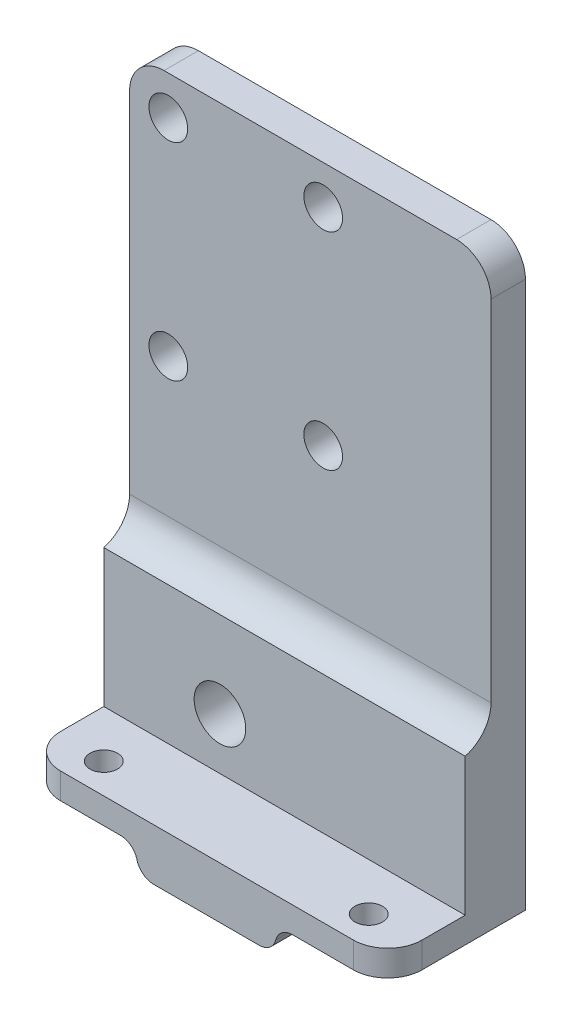
ISO-10303-21;
HEADER;
FILE_DESCRIPTION(('STEP AP214'),'2;1');
FILE_NAME('part.step','',(''),(''),'','','');
FILE_SCHEMA(('AUTOMOTIVE_DESIGN { 1 0 10303 214 1 1 1 1 }'));
ENDSEC;
DATA;
#1=APPLICATION_CONTEXT('core data for automotive mechanical design processes');
#2=APPLICATION_PROTOCOL_DEFINITION('international standard','automotive_design',2000,#1);
#3=PRODUCT_CONTEXT('',#1,'mechanical');
#4=PRODUCT('Part','Part','',(#3));
#5=PRODUCT_RELATED_PRODUCT_CATEGORY('part','',(#4));
#6=PRODUCT_DEFINITION_FORMATION('','',#4);
#7=PRODUCT_DEFINITION_CONTEXT('part definition',#1,'design');
#8=PRODUCT_DEFINITION('design','',#6,#7);
#9=PRODUCT_DEFINITION_SHAPE('','',#8);
#10=(LENGTH_UNIT() NAMED_UNIT(*) SI_UNIT(.MILLI.,.METRE.));
#11=(NAMED_UNIT(*) PLANE_ANGLE_UNIT() SI_UNIT($,.RADIAN.));
#12=(NAMED_UNIT(*) SI_UNIT($,.STERADIAN.) SOLID_ANGLE_UNIT());
#13=UNCERTAINTY_MEASURE_WITH_UNIT(LENGTH_MEASURE(1.E-05),#10,'distance_accuracy_value','');
#14=(GEOMETRIC_REPRESENTATION_CONTEXT(3) GLOBAL_UNCERTAINTY_ASSIGNED_CONTEXT((#13)) GLOBAL_UNIT_ASSIGNED_CONTEXT((#10,
#11,#12)) REPRESENTATION_CONTEXT('',''));
#15=CARTESIAN_POINT('',(0.,0.,0.));
#16=DIRECTION('',(0.,0.,1.));
#17=DIRECTION('',(1.,0.,0.));
#18=AXIS2_PLACEMENT_3D('',#15,#16,#17);
#19=CARTESIAN_POINT('',(-21.,-33.75,4.));
#20=DIRECTION('',(0.,1.,0.));
#21=DIRECTION('',(0.,0.,1.));
#22=AXIS2_PLACEMENT_3D('',#19,#20,#21);
#23=PLANE('',#22);
#24=CARTESIAN_POINT('',(-15.5,-33.75,12.5));
#25=DIRECTION('',(0.,-1.,0.));
#26=DIRECTION('',(0.,0.,-1.));
#27=AXIS2_PLACEMENT_3D('',#24,#25,#26);
#28=CIRCLE('',#27,1.6);
#29=CARTESIAN_POINT('',(-15.5,-33.75,10.9));
#30=VERTEX_POINT('',#29);
#31=EDGE_CURVE('E511',#30,#30,#28,.T.);
#32=ORIENTED_EDGE('',*,*,#31,.F.);
#33=EDGE_LOOP('',(#32));
#34=FACE_BOUND('',#33,.T.);
#35=DIRECTION('',(1.,0.,0.));
#36=VECTOR('',#35,1.);
#37=CARTESIAN_POINT('',(-21.,-33.75,0.));
#38=LINE('',#37,#36);
#39=CARTESIAN_POINT('',(-21.,-33.75,0.));
#40=VERTEX_POINT('',#39);
#41=CARTESIAN_POINT('',(-10.071835853643,-33.75,0.));
#42=VERTEX_POINT('',#41);
#43=EDGE_CURVE('E238',#40,#42,#38,.T.);
#44=ORIENTED_EDGE('',*,*,#43,.T.);
#45=DIRECTION('',(0.,0.,-1.));
#46=VECTOR('',#45,1.);
#47=CARTESIAN_POINT('',(-10.071835853643,-33.75,16.));
#48=LINE('',#47,#46);
#49=CARTESIAN_POINT('',(-10.0718358536431,-33.75,16.));
#50=VERTEX_POINT('',#49);
#51=EDGE_CURVE('E303',#42,#50,#48,.F.);
#52=ORIENTED_EDGE('',*,*,#51,.T.);
#53=DIRECTION('',(1.,0.,0.));
#54=VECTOR('',#53,1.);
#55=CARTESIAN_POINT('',(-21.,-33.75,16.));
#56=LINE('',#55,#54);
#57=CARTESIAN_POINT('',(-17.,-33.75,16.));
#58=VERTEX_POINT('',#57);
#59=EDGE_CURVE('E200',#58,#50,#56,.T.);
#60=ORIENTED_EDGE('',*,*,#59,.F.);
#61=CARTESIAN_POINT('',(-17.,-33.75,12.));
#62=DIRECTION('',(0.,1.,0.));
#63=DIRECTION('',(0.,0.,1.));
#64=AXIS2_PLACEMENT_3D('',#61,#62,#63);
#65=CIRCLE('',#64,4.);
#66=CARTESIAN_POINT('',(-21.,-33.75,12.));
#67=VERTEX_POINT('',#66);
#68=EDGE_CURVE('E273',#58,#67,#65,.F.);
#69=ORIENTED_EDGE('',*,*,#68,.T.);
#70=DIRECTION('',(0.,0.,-1.));
#71=VECTOR('',#70,1.);
#72=CARTESIAN_POINT('',(-21.,-33.75,4.));
#73=LINE('',#72,#71);
#74=EDGE_CURVE('E257',#67,#40,#73,.T.);
#75=ORIENTED_EDGE('',*,*,#74,.T.);
#76=EDGE_LOOP('',(#44,#52,#60,#69,#75));
#77=FACE_BOUND('',#76,.T.);
#78=ADVANCED_FACE('F35',(#34,#77),#23,.F.);
#79=CARTESIAN_POINT('',(15.2857245328609,-33.75,12.5));
#80=DIRECTION('',(0.,-1.,0.));
#81=DIRECTION('',(0.,0.,-1.));
#82=AXIS2_PLACEMENT_3D('',#79,#80,#81);
#83=CIRCLE('',#82,1.6);
#84=CARTESIAN_POINT('',(15.2857245328609,-33.75,10.9));
#85=VERTEX_POINT('',#84);
#86=EDGE_CURVE('E503',#85,#85,#83,.T.);
#87=ORIENTED_EDGE('',*,*,#86,.F.);
#88=EDGE_LOOP('',(#87));
#89=FACE_BOUND('',#88,.T.);
#90=CARTESIAN_POINT('',(9.92816414635696,-33.75,16.));
#91=VERTEX_POINT('',#90);
#92=CARTESIAN_POINT('',(17.,-33.75,16.));
#93=VERTEX_POINT('',#92);
#94=EDGE_CURVE('E199',#91,#93,#56,.T.);
#95=ORIENTED_EDGE('',*,*,#94,.F.);
#96=DIRECTION('',(0.,0.,1.));
#97=VECTOR('',#96,1.);
#98=CARTESIAN_POINT('',(9.92816414635696,-33.75,0.));
#99=LINE('',#98,#97);
#100=CARTESIAN_POINT('',(9.92816414635695,-33.75,0.));
#101=VERTEX_POINT('',#100);
#102=EDGE_CURVE('E301',#91,#101,#99,.F.);
#103=ORIENTED_EDGE('',*,*,#102,.T.);
#104=CARTESIAN_POINT('',(21.,-33.75,0.));
#105=VERTEX_POINT('',#104);
#106=EDGE_CURVE('E252',#101,#105,#38,.T.);
#107=ORIENTED_EDGE('',*,*,#106,.T.);
#108=DIRECTION('',(0.,0.,-1.));
#109=VECTOR('',#108,1.);
#110=CARTESIAN_POINT('',(21.,-33.75,4.));
#111=LINE('',#110,#109);
#112=CARTESIAN_POINT('',(21.,-33.75,12.));
#113=VERTEX_POINT('',#112);
#114=EDGE_CURVE('E244',#113,#105,#111,.T.);
#115=ORIENTED_EDGE('',*,*,#114,.F.);
#116=CARTESIAN_POINT('',(17.,-33.75,12.));
#117=DIRECTION('',(0.,1.,0.));
#118=DIRECTION('',(0.,0.,1.));
#119=AXIS2_PLACEMENT_3D('',#116,#117,#118);
#120=CIRCLE('',#119,4.);
#121=EDGE_CURVE('E275',#113,#93,#120,.F.);
#122=ORIENTED_EDGE('',*,*,#121,.T.);
#123=EDGE_LOOP('',(#95,#103,#107,#115,#122));
#124=FACE_BOUND('',#123,.T.);
#125=ADVANCED_FACE('F347',(#89,#124),#23,.F.);
#126=CARTESIAN_POINT('',(0.,0.,4.));
#127=DIRECTION('',(0.,0.,1.));
#128=DIRECTION('',(1.,0.,0.));
#129=AXIS2_PLACEMENT_3D('',#126,#127,#128);
#130=PLANE('',#129);
#131=CARTESIAN_POINT('',(-16.5,5.25000000000001,4.));
#132=DIRECTION('',(0.,0.,1.));
#133=DIRECTION('',(1.,0.,0.));
#134=AXIS2_PLACEMENT_3D('',#131,#132,#133);
#135=CIRCLE('',#134,2.25);
#136=CARTESIAN_POINT('',(-14.25,5.25000000000001,4.));
#137=VERTEX_POINT('',#136);
#138=EDGE_CURVE('E207',#137,#137,#135,.T.);
#139=ORIENTED_EDGE('',*,*,#138,.F.);
#140=EDGE_LOOP('',(#139));
#141=FACE_BOUND('',#140,.T.);
#142=CARTESIAN_POINT('',(-16.5,29.25,4.));
#143=DIRECTION('',(0.,0.,1.));
#144=DIRECTION('',(1.,0.,0.));
#145=AXIS2_PLACEMENT_3D('',#142,#143,#144);
#146=CIRCLE('',#145,2.25);
#147=CARTESIAN_POINT('',(-14.25,29.25,4.));
#148=VERTEX_POINT('',#147);
#149=EDGE_CURVE('E219',#148,#148,#146,.T.);
#150=ORIENTED_EDGE('',*,*,#149,.F.);
#151=EDGE_LOOP('',(#150));
#152=FACE_BOUND('',#151,.T.);
#153=CARTESIAN_POINT('',(1.5,29.25,4.));
#154=DIRECTION('',(0.,0.,1.));
#155=DIRECTION('',(1.,0.,0.));
#156=AXIS2_PLACEMENT_3D('',#153,#154,#155);
#157=CIRCLE('',#156,2.25);
#158=CARTESIAN_POINT('',(3.75,29.25,4.));
#159=VERTEX_POINT('',#158);
#160=EDGE_CURVE('E225',#159,#159,#157,.T.);
#161=ORIENTED_EDGE('',*,*,#160,.F.);
#162=EDGE_LOOP('',(#161));
#163=FACE_BOUND('',#162,.T.);
#164=CARTESIAN_POINT('',(1.50000000000001,5.25000000000001,4.));
#165=DIRECTION('',(0.,0.,1.));
#166=DIRECTION('',(1.,0.,0.));
#167=AXIS2_PLACEMENT_3D('',#164,#165,#166);
#168=CIRCLE('',#167,2.25);
#169=CARTESIAN_POINT('',(3.75000000000001,5.25000000000001,4.));
#170=VERTEX_POINT('',#169);
#171=EDGE_CURVE('E213',#170,#170,#168,.T.);
#172=ORIENTED_EDGE('',*,*,#171,.F.);
#173=EDGE_LOOP('',(#172));
#174=FACE_BOUND('',#173,.T.);
#175=DIRECTION('',(0.,1.,0.));
#176=VECTOR('',#175,1.);
#177=CARTESIAN_POINT('',(21.,33.75,4.));
#178=LINE('',#177,#176);
#179=CARTESIAN_POINT('',(21.,-10.8770166537926,4.));
#180=VERTEX_POINT('',#179);
#181=CARTESIAN_POINT('',(21.,29.75,4.));
#182=VERTEX_POINT('',#181);
#183=EDGE_CURVE('E234',#180,#182,#178,.T.);
#184=ORIENTED_EDGE('',*,*,#183,.T.);
#185=CARTESIAN_POINT('',(17.,29.75,4.));
#186=DIRECTION('',(0.,0.,1.));
#187=DIRECTION('',(1.,0.,0.));
#188=AXIS2_PLACEMENT_3D('',#185,#186,#187);
#189=CIRCLE('',#188,4.);
#190=CARTESIAN_POINT('',(17.,33.75,4.));
#191=VERTEX_POINT('',#190);
#192=EDGE_CURVE('E296',#182,#191,#189,.T.);
#193=ORIENTED_EDGE('',*,*,#192,.T.);
#194=DIRECTION('',(-1.,0.,0.));
#195=VECTOR('',#194,1.);
#196=CARTESIAN_POINT('',(-21.,33.75,4.));
#197=LINE('',#196,#195);
#198=CARTESIAN_POINT('',(-17.,33.75,4.));
#199=VERTEX_POINT('',#198);
#200=EDGE_CURVE('E237',#191,#199,#197,.T.);
#201=ORIENTED_EDGE('',*,*,#200,.T.);
#202=CARTESIAN_POINT('',(-17.,29.75,4.));
#203=DIRECTION('',(0.,0.,1.));
#204=DIRECTION('',(1.,0.,0.));
#205=AXIS2_PLACEMENT_3D('',#202,#203,#204);
#206=CIRCLE('',#205,4.);
#207=CARTESIAN_POINT('',(-21.,29.75,4.));
#208=VERTEX_POINT('',#207);
#209=EDGE_CURVE('E294',#199,#208,#206,.T.);
#210=ORIENTED_EDGE('',*,*,#209,.T.);
#211=DIRECTION('',(0.,-1.,0.));
#212=VECTOR('',#211,1.);
#213=CARTESIAN_POINT('',(-21.,33.75,4.));
#214=LINE('',#213,#212);
#215=CARTESIAN_POINT('',(-21.,-10.8770166537926,4.));
#216=VERTEX_POINT('',#215);
#217=EDGE_CURVE('E241',#208,#216,#214,.T.);
#218=ORIENTED_EDGE('',*,*,#217,.T.);
#219=DIRECTION('',(-1.,0.,0.));
#220=VECTOR('',#219,1.);
#221=CARTESIAN_POINT('',(21.,-10.8770166537926,4.));
#222=LINE('',#221,#220);
#223=EDGE_CURVE('E292',#216,#180,#222,.F.);
#224=ORIENTED_EDGE('',*,*,#223,.T.);
#225=EDGE_LOOP('',(#184,#193,#201,#210,#218,#224));
#226=FACE_BOUND('',#225,.T.);
#227=ADVANCED_FACE('F358',(#141,#152,#163,#174,#226),#130,.T.);
#228=CARTESIAN_POINT('',(-21.,-30.75,16.));
#229=DIRECTION('',(0.,-1.,0.));
#230=DIRECTION('',(1.,0.,0.));
#231=AXIS2_PLACEMENT_3D('',#228,#229,#230);
#232=PLANE('',#231);
#233=CARTESIAN_POINT('',(15.2857245328609,-30.75,12.5));
#234=DIRECTION('',(0.,-1.,0.));
#235=DIRECTION('',(1.,0.,0.));
#236=AXIS2_PLACEMENT_3D('',#233,#234,#235);
#237=CIRCLE('',#236,1.6);
#238=CARTESIAN_POINT('',(16.8857245328609,-30.75,12.5));
#239=VERTEX_POINT('',#238);
#240=EDGE_CURVE('E506',#239,#239,#237,.F.);
#241=ORIENTED_EDGE('',*,*,#240,.F.);
#242=EDGE_LOOP('',(#241));
#243=FACE_BOUND('',#242,.T.);
#244=CARTESIAN_POINT('',(-15.5,-30.75,12.5));
#245=DIRECTION('',(0.,-1.,0.));
#246=DIRECTION('',(1.,0.,0.));
#247=AXIS2_PLACEMENT_3D('',#244,#245,#246);
#248=CIRCLE('',#247,1.6);
#249=CARTESIAN_POINT('',(-13.9,-30.75,12.5));
#250=VERTEX_POINT('',#249);
#251=EDGE_CURVE('E193',#250,#250,#248,.F.);
#252=ORIENTED_EDGE('',*,*,#251,.F.);
#253=EDGE_LOOP('',(#252));
#254=FACE_BOUND('',#253,.T.);
#255=DIRECTION('',(-1.,0.,0.));
#256=VECTOR('',#255,1.);
#257=CARTESIAN_POINT('',(-21.,-30.75,16.));
#258=LINE('',#257,#256);
#259=CARTESIAN_POINT('',(17.,-30.75,16.));
#260=VERTEX_POINT('',#259);
#261=CARTESIAN_POINT('',(-17.,-30.75,16.));
#262=VERTEX_POINT('',#261);
#263=EDGE_CURVE('E203',#260,#262,#258,.T.);
#264=ORIENTED_EDGE('',*,*,#263,.F.);
#265=CARTESIAN_POINT('',(17.,-30.75,12.));
#266=DIRECTION('',(0.,-1.,0.));
#267=DIRECTION('',(1.,0.,0.));
#268=AXIS2_PLACEMENT_3D('',#265,#266,#267);
#269=CIRCLE('',#268,4.);
#270=CARTESIAN_POINT('',(21.,-30.75,12.));
#271=VERTEX_POINT('',#270);
#272=EDGE_CURVE('E168',#260,#271,#269,.F.);
#273=ORIENTED_EDGE('',*,*,#272,.T.);
#274=DIRECTION('',(0.,0.,-1.));
#275=VECTOR('',#274,1.);
#276=CARTESIAN_POINT('',(21.,-30.75,16.));
#277=LINE('',#276,#275);
#278=CARTESIAN_POINT('',(21.,-30.75,7.));
#279=VERTEX_POINT('',#278);
#280=EDGE_CURVE('E161',#271,#279,#277,.T.);
#281=ORIENTED_EDGE('',*,*,#280,.T.);
#282=DIRECTION('',(1.,0.,0.));
#283=VECTOR('',#282,1.);
#284=CARTESIAN_POINT('',(21.,-30.75,7.));
#285=LINE('',#284,#283);
#286=CARTESIAN_POINT('',(-21.,-30.75,7.));
#287=VERTEX_POINT('',#286);
#288=EDGE_CURVE('E167',#287,#279,#285,.T.);
#289=ORIENTED_EDGE('',*,*,#288,.F.);
#290=DIRECTION('',(0.,0.,-1.));
#291=VECTOR('',#290,1.);
#292=CARTESIAN_POINT('',(-21.,-30.75,16.));
#293=LINE('',#292,#291);
#294=CARTESIAN_POINT('',(-21.,-30.75,12.));
#295=VERTEX_POINT('',#294);
#296=EDGE_CURVE('E172',#295,#287,#293,.T.);
#297=ORIENTED_EDGE('',*,*,#296,.F.);
#298=CARTESIAN_POINT('',(-17.,-30.75,12.));
#299=DIRECTION('',(0.,-1.,0.));
#300=DIRECTION('',(1.,0.,0.));
#301=AXIS2_PLACEMENT_3D('',#298,#299,#300);
#302=CIRCLE('',#301,4.);
#303=EDGE_CURVE('E266',#295,#262,#302,.F.);
#304=ORIENTED_EDGE('',*,*,#303,.T.);
#305=EDGE_LOOP('',(#264,#273,#281,#289,#297,#304));
#306=FACE_BOUND('',#305,.T.);
#307=ADVANCED_FACE('F164',(#243,#254,#306),#232,.F.);
#308=CARTESIAN_POINT('',(0.,0.,0.));
#309=DIRECTION('',(0.,0.,1.));
#310=DIRECTION('',(1.,0.,0.));
#311=AXIS2_PLACEMENT_3D('',#308,#309,#310);
#312=PLANE('',#311);
#313=CARTESIAN_POINT('',(9.92816414635696,-35.75,0.));
#314=DIRECTION('',(0.,0.,1.));
#315=DIRECTION('',(1.,0.,0.));
#316=AXIS2_PLACEMENT_3D('',#313,#314,#315);
#317=CIRCLE('',#316,2.);
#318=CARTESIAN_POINT('',(7.99167247325325,-35.25,0.));
#319=VERTEX_POINT('',#318);
#320=EDGE_CURVE('E307',#101,#319,#317,.T.);
#321=ORIENTED_EDGE('',*,*,#320,.T.);
#322=CARTESIAN_POINT('',(6.05518080014954,-34.75,0.));
#323=DIRECTION('',(0.,0.,1.));
#324=DIRECTION('',(1.,0.,0.));
#325=AXIS2_PLACEMENT_3D('',#322,#323,#324);
#326=CIRCLE('',#325,2.);
#327=CARTESIAN_POINT('',(6.05518080014954,-36.75,0.));
#328=VERTEX_POINT('',#327);
#329=EDGE_CURVE('E43',#319,#328,#326,.F.);
#330=ORIENTED_EDGE('',*,*,#329,.T.);
#331=DIRECTION('',(1.,0.,0.));
#332=VECTOR('',#331,1.);
#333=CARTESIAN_POINT('',(-8.07183585364304,-36.75,0.));
#334=LINE('',#333,#332);
#335=CARTESIAN_POINT('',(-6.19885250743562,-36.75,0.));
#336=VERTEX_POINT('',#335);
#337=EDGE_CURVE('E329',#336,#328,#334,.T.);
#338=ORIENTED_EDGE('',*,*,#337,.F.);
#339=CARTESIAN_POINT('',(-6.19885250743562,-34.75,0.));
#340=DIRECTION('',(0.,0.,1.));
#341=DIRECTION('',(1.,0.,0.));
#342=AXIS2_PLACEMENT_3D('',#339,#340,#341);
#343=CIRCLE('',#342,2.);
#344=CARTESIAN_POINT('',(-8.13534418053933,-35.25,0.));
#345=VERTEX_POINT('',#344);
#346=EDGE_CURVE('E50',#336,#345,#343,.F.);
#347=ORIENTED_EDGE('',*,*,#346,.T.);
#348=CARTESIAN_POINT('',(-10.071835853643,-35.75,0.));
#349=DIRECTION('',(0.,0.,1.));
#350=DIRECTION('',(1.,0.,0.));
#351=AXIS2_PLACEMENT_3D('',#348,#349,#350);
#352=CIRCLE('',#351,2.);
#353=EDGE_CURVE('E309',#345,#42,#352,.T.);
#354=ORIENTED_EDGE('',*,*,#353,.T.);
#355=ORIENTED_EDGE('',*,*,#43,.F.);
#356=DIRECTION('',(0.,-1.,0.));
#357=VECTOR('',#356,1.);
#358=CARTESIAN_POINT('',(-21.,33.75,0.));
#359=LINE('',#358,#357);
#360=CARTESIAN_POINT('',(-21.,29.75,0.));
#361=VERTEX_POINT('',#360);
#362=EDGE_CURVE('E250',#361,#40,#359,.T.);
#363=ORIENTED_EDGE('',*,*,#362,.F.);
#364=CARTESIAN_POINT('',(-17.,29.75,0.));
#365=DIRECTION('',(0.,0.,1.));
#366=DIRECTION('',(1.,0.,0.));
#367=AXIS2_PLACEMENT_3D('',#364,#365,#366);
#368=CIRCLE('',#367,4.);
#369=CARTESIAN_POINT('',(-17.,33.75,0.));
#370=VERTEX_POINT('',#369);
#371=EDGE_CURVE('E288',#361,#370,#368,.F.);
#372=ORIENTED_EDGE('',*,*,#371,.T.);
#373=DIRECTION('',(-1.,0.,0.));
#374=VECTOR('',#373,1.);
#375=CARTESIAN_POINT('',(-21.,33.75,0.));
#376=LINE('',#375,#374);
#377=CARTESIAN_POINT('',(17.,33.75,0.));
#378=VERTEX_POINT('',#377);
#379=EDGE_CURVE('E247',#378,#370,#376,.T.);
#380=ORIENTED_EDGE('',*,*,#379,.F.);
#381=CARTESIAN_POINT('',(17.,29.75,0.));
#382=DIRECTION('',(0.,0.,1.));
#383=DIRECTION('',(1.,0.,0.));
#384=AXIS2_PLACEMENT_3D('',#381,#382,#383);
#385=CIRCLE('',#384,4.);
#386=CARTESIAN_POINT('',(21.,29.75,0.));
#387=VERTEX_POINT('',#386);
#388=EDGE_CURVE('E290',#378,#387,#385,.F.);
#389=ORIENTED_EDGE('',*,*,#388,.T.);
#390=DIRECTION('',(0.,1.,0.));
#391=VECTOR('',#390,1.);
#392=CARTESIAN_POINT('',(21.,33.75,0.));
#393=LINE('',#392,#391);
#394=EDGE_CURVE('E233',#105,#387,#393,.T.);
#395=ORIENTED_EDGE('',*,*,#394,.F.);
#396=ORIENTED_EDGE('',*,*,#106,.F.);
#397=EDGE_LOOP('',(#321,#330,#338,#347,#354,#355,#363,#372,#380,#389,#395,#396));
#398=FACE_BOUND('',#397,.T.);
#399=CARTESIAN_POINT('',(-7.49999999999999,-24.75,0.));
#400=DIRECTION('',(0.,0.,1.));
#401=DIRECTION('',(1.,0.,0.));
#402=AXIS2_PLACEMENT_3D('',#399,#400,#401);
#403=CIRCLE('',#402,3.);
#404=CARTESIAN_POINT('',(-4.49999999999999,-24.75,0.));
#405=VERTEX_POINT('',#404);
#406=EDGE_CURVE('E228',#405,#405,#403,.T.);
#407=ORIENTED_EDGE('',*,*,#406,.T.);
#408=EDGE_LOOP('',(#407));
#409=FACE_BOUND('',#408,.T.);
#410=CARTESIAN_POINT('',(1.5,29.25,0.));
#411=DIRECTION('',(0.,0.,1.));
#412=DIRECTION('',(1.,0.,0.));
#413=AXIS2_PLACEMENT_3D('',#410,#411,#412);
#414=CIRCLE('',#413,2.25);
#415=CARTESIAN_POINT('',(3.75,29.25,0.));
#416=VERTEX_POINT('',#415);
#417=EDGE_CURVE('E222',#416,#416,#414,.T.);
#418=ORIENTED_EDGE('',*,*,#417,.T.);
#419=EDGE_LOOP('',(#418));
#420=FACE_BOUND('',#419,.T.);
#421=CARTESIAN_POINT('',(-16.5,29.25,0.));
#422=DIRECTION('',(0.,0.,1.));
#423=DIRECTION('',(1.,0.,0.));
#424=AXIS2_PLACEMENT_3D('',#421,#422,#423);
#425=CIRCLE('',#424,2.25);
#426=CARTESIAN_POINT('',(-14.25,29.25,0.));
#427=VERTEX_POINT('',#426);
#428=EDGE_CURVE('E216',#427,#427,#425,.T.);
#429=ORIENTED_EDGE('',*,*,#428,.T.);
#430=EDGE_LOOP('',(#429));
#431=FACE_BOUND('',#430,.T.);
#432=CARTESIAN_POINT('',(1.50000000000001,5.25000000000001,0.));
#433=DIRECTION('',(0.,0.,1.));
#434=DIRECTION('',(1.,0.,0.));
#435=AXIS2_PLACEMENT_3D('',#432,#433,#434);
#436=CIRCLE('',#435,2.25);
#437=CARTESIAN_POINT('',(3.75000000000001,5.25000000000001,0.));
#438=VERTEX_POINT('',#437);
#439=EDGE_CURVE('E210',#438,#438,#436,.T.);
#440=ORIENTED_EDGE('',*,*,#439,.T.);
#441=EDGE_LOOP('',(#440));
#442=FACE_BOUND('',#441,.T.);
#443=CARTESIAN_POINT('',(-16.5,5.25000000000001,0.));
#444=DIRECTION('',(0.,0.,1.));
#445=DIRECTION('',(1.,0.,0.));
#446=AXIS2_PLACEMENT_3D('',#443,#444,#445);
#447=CIRCLE('',#446,2.25);
#448=CARTESIAN_POINT('',(-14.25,5.25000000000001,0.));
#449=VERTEX_POINT('',#448);
#450=EDGE_CURVE('E171',#449,#449,#447,.T.);
#451=ORIENTED_EDGE('',*,*,#450,.T.);
#452=EDGE_LOOP('',(#451));
#453=FACE_BOUND('',#452,.T.);
#454=ADVANCED_FACE('F327',(#398,#409,#420,#431,#442,#453),#312,.F.);
#455=CARTESIAN_POINT('',(21.,33.75,4.));
#456=DIRECTION('',(-1.,0.,0.));
#457=DIRECTION('',(0.,-1.,0.));
#458=AXIS2_PLACEMENT_3D('',#455,#456,#457);
#459=PLANE('',#458);
#460=ORIENTED_EDGE('',*,*,#280,.F.);
#461=DIRECTION('',(0.,1.,0.));
#462=VECTOR('',#461,1.);
#463=CARTESIAN_POINT('',(21.,-33.75,12.));
#464=LINE('',#463,#462);
#465=EDGE_CURVE('E271',#271,#113,#464,.F.);
#466=ORIENTED_EDGE('',*,*,#465,.T.);
#467=ORIENTED_EDGE('',*,*,#114,.T.);
#468=ORIENTED_EDGE('',*,*,#394,.T.);
#469=DIRECTION('',(0.,0.,-1.));
#470=VECTOR('',#469,1.);
#471=CARTESIAN_POINT('',(21.,29.75,4.));
#472=LINE('',#471,#470);
#473=EDGE_CURVE('E269',#387,#182,#472,.F.);
#474=ORIENTED_EDGE('',*,*,#473,.T.);
#475=ORIENTED_EDGE('',*,*,#183,.F.);
#476=CARTESIAN_POINT('',(21.,-10.8770166537926,8.));
#477=DIRECTION('',(-1.,0.,0.));
#478=DIRECTION('',(0.,-1.,0.));
#479=AXIS2_PLACEMENT_3D('',#476,#477,#478);
#480=CIRCLE('',#479,4.);
#481=CARTESIAN_POINT('',(21.,-14.75,7.));
#482=VERTEX_POINT('',#481);
#483=EDGE_CURVE('E179',#180,#482,#480,.T.);
#484=ORIENTED_EDGE('',*,*,#483,.T.);
#485=DIRECTION('',(0.,1.,0.));
#486=VECTOR('',#485,1.);
#487=CARTESIAN_POINT('',(21.,-14.75,7.));
#488=LINE('',#487,#486);
#489=EDGE_CURVE('E175',#279,#482,#488,.T.);
#490=ORIENTED_EDGE('',*,*,#489,.F.);
#491=EDGE_LOOP('',(#460,#466,#467,#468,#474,#475,#484,#490));
#492=FACE_BOUND('',#491,.T.);
#493=ADVANCED_FACE('F176',(#492),#459,.F.);
#494=CARTESIAN_POINT('',(-21.,33.75,4.));
#495=DIRECTION('',(0.,-1.,0.));
#496=DIRECTION('',(0.,0.,-1.));
#497=AXIS2_PLACEMENT_3D('',#494,#495,#496);
#498=PLANE('',#497);
#499=ORIENTED_EDGE('',*,*,#200,.F.);
#500=DIRECTION('',(0.,0.,-1.));
#501=VECTOR('',#500,1.);
#502=CARTESIAN_POINT('',(17.,33.75,4.));
#503=LINE('',#502,#501);
#504=EDGE_CURVE('E285',#191,#378,#503,.T.);
#505=ORIENTED_EDGE('',*,*,#504,.T.);
#506=ORIENTED_EDGE('',*,*,#379,.T.);
#507=DIRECTION('',(0.,0.,-1.));
#508=VECTOR('',#507,1.);
#509=CARTESIAN_POINT('',(-17.,33.75,4.));
#510=LINE('',#509,#508);
#511=EDGE_CURVE('E283',#370,#199,#510,.F.);
#512=ORIENTED_EDGE('',*,*,#511,.T.);
#513=EDGE_LOOP('',(#499,#505,#506,#512));
#514=FACE_BOUND('',#513,.T.);
#515=ADVANCED_FACE('F361',(#514),#498,.F.);
#516=CARTESIAN_POINT('',(-21.,33.75,4.));
#517=DIRECTION('',(1.,0.,0.));
#518=DIRECTION('',(0.,1.,0.));
#519=AXIS2_PLACEMENT_3D('',#516,#517,#518);
#520=PLANE('',#519);
#521=ORIENTED_EDGE('',*,*,#74,.F.);
#522=DIRECTION('',(0.,-1.,0.));
#523=VECTOR('',#522,1.);
#524=CARTESIAN_POINT('',(-21.,-30.75,12.));
#525=LINE('',#524,#523);
#526=EDGE_CURVE('E281',#67,#295,#525,.F.);
#527=ORIENTED_EDGE('',*,*,#526,.T.);
#528=ORIENTED_EDGE('',*,*,#296,.T.);
#529=DIRECTION('',(0.,-1.,0.));
#530=VECTOR('',#529,1.);
#531=CARTESIAN_POINT('',(-21.,-30.75,7.));
#532=LINE('',#531,#530);
#533=CARTESIAN_POINT('',(-21.,-14.75,7.));
#534=VERTEX_POINT('',#533);
#535=EDGE_CURVE('E189',#534,#287,#532,.T.);
#536=ORIENTED_EDGE('',*,*,#535,.F.);
#537=CARTESIAN_POINT('',(-21.,-10.8770166537926,8.));
#538=DIRECTION('',(1.,0.,0.));
#539=DIRECTION('',(0.,1.,0.));
#540=AXIS2_PLACEMENT_3D('',#537,#538,#539);
#541=CIRCLE('',#540,4.);
#542=EDGE_CURVE('E298',#534,#216,#541,.T.);
#543=ORIENTED_EDGE('',*,*,#542,.T.);
#544=ORIENTED_EDGE('',*,*,#217,.F.);
#545=DIRECTION('',(0.,0.,-1.));
#546=VECTOR('',#545,1.);
#547=CARTESIAN_POINT('',(-21.,29.75,4.));
#548=LINE('',#547,#546);
#549=EDGE_CURVE('E278',#208,#361,#548,.T.);
#550=ORIENTED_EDGE('',*,*,#549,.T.);
#551=ORIENTED_EDGE('',*,*,#362,.T.);
#552=EDGE_LOOP('',(#521,#527,#528,#536,#543,#544,#550,#551));
#553=FACE_BOUND('',#552,.T.);
#554=ADVANCED_FACE('F370',(#553),#520,.F.);
#555=CARTESIAN_POINT('',(-7.49999999999999,-24.75,4.));
#556=DIRECTION('',(0.,0.,-1.));
#557=DIRECTION('',(-1.,0.,0.));
#558=AXIS2_PLACEMENT_3D('',#555,#556,#557);
#559=CYLINDRICAL_SURFACE('',#558,3.);
#560=ORIENTED_EDGE('',*,*,#406,.F.);
#561=EDGE_LOOP('',(#560));
#562=FACE_BOUND('',#561,.T.);
#563=CARTESIAN_POINT('',(-7.49999999999999,-24.75,7.));
#564=DIRECTION('',(0.,0.,1.));
#565=DIRECTION('',(1.,0.,0.));
#566=AXIS2_PLACEMENT_3D('',#563,#564,#565);
#567=CIRCLE('',#566,3.);
#568=CARTESIAN_POINT('',(-4.49999999999999,-24.75,7.));
#569=VERTEX_POINT('',#568);
#570=EDGE_CURVE('E190',#569,#569,#567,.T.);
#571=ORIENTED_EDGE('',*,*,#570,.T.);
#572=EDGE_LOOP('',(#571));
#573=FACE_BOUND('',#572,.T.);
#574=ADVANCED_FACE('F397',(#562,#573),#559,.F.);
#575=CARTESIAN_POINT('',(1.5,29.25,4.));
#576=DIRECTION('',(0.,0.,-1.));
#577=DIRECTION('',(-1.,0.,0.));
#578=AXIS2_PLACEMENT_3D('',#575,#576,#577);
#579=CYLINDRICAL_SURFACE('',#578,2.25);
#580=ORIENTED_EDGE('',*,*,#160,.T.);
#581=EDGE_LOOP('',(#580));
#582=FACE_BOUND('',#581,.T.);
#583=ORIENTED_EDGE('',*,*,#417,.F.);
#584=EDGE_LOOP('',(#583));
#585=FACE_BOUND('',#584,.T.);
#586=ADVANCED_FACE('F535',(#582,#585),#579,.F.);
#587=CARTESIAN_POINT('',(-16.5,29.25,4.));
#588=DIRECTION('',(0.,0.,-1.));
#589=DIRECTION('',(-1.,0.,0.));
#590=AXIS2_PLACEMENT_3D('',#587,#588,#589);
#591=CYLINDRICAL_SURFACE('',#590,2.25);
#592=ORIENTED_EDGE('',*,*,#149,.T.);
#593=EDGE_LOOP('',(#592));
#594=FACE_BOUND('',#593,.T.);
#595=ORIENTED_EDGE('',*,*,#428,.F.);
#596=EDGE_LOOP('',(#595));
#597=FACE_BOUND('',#596,.T.);
#598=ADVANCED_FACE('F531',(#594,#597),#591,.F.);
#599=CARTESIAN_POINT('',(1.50000000000001,5.25000000000001,4.));
#600=DIRECTION('',(0.,0.,-1.));
#601=DIRECTION('',(-1.,0.,0.));
#602=AXIS2_PLACEMENT_3D('',#599,#600,#601);
#603=CYLINDRICAL_SURFACE('',#602,2.25);
#604=ORIENTED_EDGE('',*,*,#171,.T.);
#605=EDGE_LOOP('',(#604));
#606=FACE_BOUND('',#605,.T.);
#607=ORIENTED_EDGE('',*,*,#439,.F.);
#608=EDGE_LOOP('',(#607));
#609=FACE_BOUND('',#608,.T.);
#610=ADVANCED_FACE('F527',(#606,#609),#603,.F.);
#611=CARTESIAN_POINT('',(-16.5,5.25000000000001,4.));
#612=DIRECTION('',(0.,0.,-1.));
#613=DIRECTION('',(-1.,0.,0.));
#614=AXIS2_PLACEMENT_3D('',#611,#612,#613);
#615=CYLINDRICAL_SURFACE('',#614,2.25);
#616=ORIENTED_EDGE('',*,*,#138,.T.);
#617=EDGE_LOOP('',(#616));
#618=FACE_BOUND('',#617,.T.);
#619=ORIENTED_EDGE('',*,*,#450,.F.);
#620=EDGE_LOOP('',(#619));
#621=FACE_BOUND('',#620,.T.);
#622=ADVANCED_FACE('F455',(#618,#621),#615,.F.);
#623=CARTESIAN_POINT('',(0.,0.,16.));
#624=DIRECTION('',(0.,0.,1.));
#625=DIRECTION('',(1.,0.,0.));
#626=AXIS2_PLACEMENT_3D('',#623,#624,#625);
#627=PLANE('',#626);
#628=DIRECTION('',(-1.,0.,0.));
#629=VECTOR('',#628,1.);
#630=CARTESIAN_POINT('',(-8.07183585364305,-36.75,16.));
#631=LINE('',#630,#629);
#632=CARTESIAN_POINT('',(6.05518080014955,-36.75,16.));
#633=VERTEX_POINT('',#632);
#634=CARTESIAN_POINT('',(-6.19885250743563,-36.75,16.));
#635=VERTEX_POINT('',#634);
#636=EDGE_CURVE('E338',#633,#635,#631,.T.);
#637=ORIENTED_EDGE('',*,*,#636,.F.);
#638=CARTESIAN_POINT('',(6.05518080014955,-34.75,16.));
#639=DIRECTION('',(0.,0.,1.));
#640=DIRECTION('',(1.,0.,0.));
#641=AXIS2_PLACEMENT_3D('',#638,#639,#640);
#642=CIRCLE('',#641,2.);
#643=CARTESIAN_POINT('',(7.99167247325325,-35.25,16.));
#644=VERTEX_POINT('',#643);
#645=EDGE_CURVE('E322',#633,#644,#642,.T.);
#646=ORIENTED_EDGE('',*,*,#645,.T.);
#647=CARTESIAN_POINT('',(9.92816414635696,-35.75,16.));
#648=DIRECTION('',(0.,0.,1.));
#649=DIRECTION('',(1.,0.,0.));
#650=AXIS2_PLACEMENT_3D('',#647,#648,#649);
#651=CIRCLE('',#650,2.);
#652=EDGE_CURVE('E305',#644,#91,#651,.F.);
#653=ORIENTED_EDGE('',*,*,#652,.T.);
#654=ORIENTED_EDGE('',*,*,#94,.T.);
#655=DIRECTION('',(0.,1.,0.));
#656=VECTOR('',#655,1.);
#657=CARTESIAN_POINT('',(17.,-30.75,16.));
#658=LINE('',#657,#656);
#659=EDGE_CURVE('E263',#93,#260,#658,.T.);
#660=ORIENTED_EDGE('',*,*,#659,.T.);
#661=ORIENTED_EDGE('',*,*,#263,.T.);
#662=DIRECTION('',(0.,-1.,0.));
#663=VECTOR('',#662,1.);
#664=CARTESIAN_POINT('',(-17.,-33.75,16.));
#665=LINE('',#664,#663);
#666=EDGE_CURVE('E260',#262,#58,#665,.T.);
#667=ORIENTED_EDGE('',*,*,#666,.T.);
#668=ORIENTED_EDGE('',*,*,#59,.T.);
#669=CARTESIAN_POINT('',(-10.071835853643,-35.75,16.));
#670=DIRECTION('',(0.,0.,1.));
#671=DIRECTION('',(1.,0.,0.));
#672=AXIS2_PLACEMENT_3D('',#669,#670,#671);
#673=CIRCLE('',#672,2.);
#674=CARTESIAN_POINT('',(-8.13534418053934,-35.25,16.));
#675=VERTEX_POINT('',#674);
#676=EDGE_CURVE('E311',#50,#675,#673,.F.);
#677=ORIENTED_EDGE('',*,*,#676,.T.);
#678=CARTESIAN_POINT('',(-6.19885250743563,-34.75,16.));
#679=DIRECTION('',(0.,0.,1.));
#680=DIRECTION('',(1.,0.,0.));
#681=AXIS2_PLACEMENT_3D('',#678,#679,#680);
#682=CIRCLE('',#681,2.);
#683=EDGE_CURVE('E320',#675,#635,#682,.T.);
#684=ORIENTED_EDGE('',*,*,#683,.T.);
#685=EDGE_LOOP('',(#637,#646,#653,#654,#660,#661,#667,#668,#677,#684));
#686=FACE_BOUND('',#685,.T.);
#687=ADVANCED_FACE('F342',(#686),#627,.T.);
#688=CARTESIAN_POINT('',(0.,0.,7.));
#689=DIRECTION('',(0.,0.,-1.));
#690=DIRECTION('',(-1.,0.,0.));
#691=AXIS2_PLACEMENT_3D('',#688,#689,#690);
#692=PLANE('',#691);
#693=ORIENTED_EDGE('',*,*,#288,.T.);
#694=ORIENTED_EDGE('',*,*,#489,.T.);
#695=DIRECTION('',(-1.,0.,0.));
#696=VECTOR('',#695,1.);
#697=CARTESIAN_POINT('',(-21.,-14.75,7.));
#698=LINE('',#697,#696);
#699=EDGE_CURVE('E183',#482,#534,#698,.T.);
#700=ORIENTED_EDGE('',*,*,#699,.T.);
#701=ORIENTED_EDGE('',*,*,#535,.T.);
#702=EDGE_LOOP('',(#693,#694,#700,#701));
#703=FACE_BOUND('',#702,.T.);
#704=ORIENTED_EDGE('',*,*,#570,.F.);
#705=EDGE_LOOP('',(#704));
#706=FACE_BOUND('',#705,.T.);
#707=ADVANCED_FACE('F186',(#703,#706),#692,.F.);
#708=CARTESIAN_POINT('',(-15.5,33.751,12.5));
#709=DIRECTION('',(0.,-1.,0.));
#710=DIRECTION('',(0.,0.,-1.));
#711=AXIS2_PLACEMENT_3D('',#708,#709,#710);
#712=CYLINDRICAL_SURFACE('',#711,1.6);
#713=ORIENTED_EDGE('',*,*,#31,.T.);
#714=EDGE_LOOP('',(#713));
#715=FACE_BOUND('',#714,.T.);
#716=ORIENTED_EDGE('',*,*,#251,.T.);
#717=EDGE_LOOP('',(#716));
#718=FACE_BOUND('',#717,.T.);
#719=ADVANCED_FACE('F516',(#715,#718),#712,.F.);
#720=CARTESIAN_POINT('',(15.2857245328609,33.751,12.5));
#721=DIRECTION('',(0.,-1.,0.));
#722=DIRECTION('',(0.,0.,-1.));
#723=AXIS2_PLACEMENT_3D('',#720,#721,#722);
#724=CYLINDRICAL_SURFACE('',#723,1.6);
#725=ORIENTED_EDGE('',*,*,#86,.T.);
#726=EDGE_LOOP('',(#725));
#727=FACE_BOUND('',#726,.T.);
#728=ORIENTED_EDGE('',*,*,#240,.T.);
#729=EDGE_LOOP('',(#728));
#730=FACE_BOUND('',#729,.T.);
#731=ADVANCED_FACE('F406',(#727,#730),#724,.F.);
#732=CARTESIAN_POINT('',(17.,0.,12.));
#733=DIRECTION('',(0.,-1.,0.));
#734=DIRECTION('',(1.,0.,0.));
#735=AXIS2_PLACEMENT_3D('',#732,#733,#734);
#736=CYLINDRICAL_SURFACE('',#735,4.);
#737=ORIENTED_EDGE('',*,*,#121,.F.);
#738=ORIENTED_EDGE('',*,*,#465,.F.);
#739=ORIENTED_EDGE('',*,*,#272,.F.);
#740=ORIENTED_EDGE('',*,*,#659,.F.);
#741=EDGE_LOOP('',(#737,#738,#739,#740));
#742=FACE_BOUND('',#741,.T.);
#743=ADVANCED_FACE('F402',(#742),#736,.T.);
#744=CARTESIAN_POINT('',(-17.,0.,12.));
#745=DIRECTION('',(0.,1.,0.));
#746=DIRECTION('',(-1.,0.,0.));
#747=AXIS2_PLACEMENT_3D('',#744,#745,#746);
#748=CYLINDRICAL_SURFACE('',#747,4.);
#749=ORIENTED_EDGE('',*,*,#303,.F.);
#750=ORIENTED_EDGE('',*,*,#526,.F.);
#751=ORIENTED_EDGE('',*,*,#68,.F.);
#752=ORIENTED_EDGE('',*,*,#666,.F.);
#753=EDGE_LOOP('',(#749,#750,#751,#752));
#754=FACE_BOUND('',#753,.T.);
#755=ADVANCED_FACE('F405',(#754),#748,.T.);
#756=CARTESIAN_POINT('',(17.,29.75,4.));
#757=DIRECTION('',(0.,0.,-1.));
#758=DIRECTION('',(-1.,0.,0.));
#759=AXIS2_PLACEMENT_3D('',#756,#757,#758);
#760=CYLINDRICAL_SURFACE('',#759,4.);
#761=ORIENTED_EDGE('',*,*,#192,.F.);
#762=ORIENTED_EDGE('',*,*,#473,.F.);
#763=ORIENTED_EDGE('',*,*,#388,.F.);
#764=ORIENTED_EDGE('',*,*,#504,.F.);
#765=EDGE_LOOP('',(#761,#762,#763,#764));
#766=FACE_BOUND('',#765,.T.);
#767=ADVANCED_FACE('F354',(#766),#760,.T.);
#768=CARTESIAN_POINT('',(-17.,29.75,4.));
#769=DIRECTION('',(0.,0.,-1.));
#770=DIRECTION('',(-1.,0.,0.));
#771=AXIS2_PLACEMENT_3D('',#768,#769,#770);
#772=CYLINDRICAL_SURFACE('',#771,4.);
#773=ORIENTED_EDGE('',*,*,#209,.F.);
#774=ORIENTED_EDGE('',*,*,#511,.F.);
#775=ORIENTED_EDGE('',*,*,#371,.F.);
#776=ORIENTED_EDGE('',*,*,#549,.F.);
#777=EDGE_LOOP('',(#773,#774,#775,#776));
#778=FACE_BOUND('',#777,.T.);
#779=ADVANCED_FACE('F364',(#778),#772,.T.);
#780=CARTESIAN_POINT('',(-21.,-10.8770166537926,8.));
#781=DIRECTION('',(1.,0.,0.));
#782=DIRECTION('',(0.,0.,-1.));
#783=AXIS2_PLACEMENT_3D('',#780,#781,#782);
#784=CYLINDRICAL_SURFACE('',#783,4.);
#785=ORIENTED_EDGE('',*,*,#483,.F.);
#786=ORIENTED_EDGE('',*,*,#223,.F.);
#787=ORIENTED_EDGE('',*,*,#542,.F.);
#788=ORIENTED_EDGE('',*,*,#699,.F.);
#789=EDGE_LOOP('',(#785,#786,#787,#788));
#790=FACE_BOUND('',#789,.T.);
#791=ADVANCED_FACE('F373',(#790),#784,.F.);
#792=CARTESIAN_POINT('',(0.,-36.75,0.));
#793=DIRECTION('',(0.,1.,0.));
#794=DIRECTION('',(0.,0.,1.));
#795=AXIS2_PLACEMENT_3D('',#792,#793,#794);
#796=PLANE('',#795);
#797=ORIENTED_EDGE('',*,*,#337,.T.);
#798=DIRECTION('',(0.,0.,-1.));
#799=VECTOR('',#798,1.);
#800=CARTESIAN_POINT('',(6.05518080014954,-36.75,0.));
#801=LINE('',#800,#799);
#802=EDGE_CURVE('E317',#328,#633,#801,.F.);
#803=ORIENTED_EDGE('',*,*,#802,.T.);
#804=ORIENTED_EDGE('',*,*,#636,.T.);
#805=DIRECTION('',(0.,0.,1.));
#806=VECTOR('',#805,1.);
#807=CARTESIAN_POINT('',(-6.19885250743562,-36.75,0.));
#808=LINE('',#807,#806);
#809=EDGE_CURVE('E314',#635,#336,#808,.F.);
#810=ORIENTED_EDGE('',*,*,#809,.T.);
#811=EDGE_LOOP('',(#797,#803,#804,#810));
#812=FACE_BOUND('',#811,.T.);
#813=ADVANCED_FACE('F334',(#812),#796,.F.);
#814=CARTESIAN_POINT('',(9.92816414635696,-35.75,0.));
#815=DIRECTION('',(0.,0.,-1.));
#816=DIRECTION('',(-1.,0.,0.));
#817=AXIS2_PLACEMENT_3D('',#814,#815,#816);
#818=CYLINDRICAL_SURFACE('',#817,2.);
#819=ORIENTED_EDGE('',*,*,#652,.F.);
#820=DIRECTION('',(0.,0.,-1.));
#821=VECTOR('',#820,1.);
#822=CARTESIAN_POINT('',(7.99167247325325,-35.25,0.));
#823=LINE('',#822,#821);
#824=EDGE_CURVE('E58',#644,#319,#823,.T.);
#825=ORIENTED_EDGE('',*,*,#824,.T.);
#826=ORIENTED_EDGE('',*,*,#320,.F.);
#827=ORIENTED_EDGE('',*,*,#102,.F.);
#828=EDGE_LOOP('',(#819,#825,#826,#827));
#829=FACE_BOUND('',#828,.T.);
#830=ADVANCED_FACE('F345',(#829),#818,.F.);
#831=CARTESIAN_POINT('',(-10.071835853643,-35.75,0.));
#832=DIRECTION('',(0.,0.,1.));
#833=DIRECTION('',(1.,0.,0.));
#834=AXIS2_PLACEMENT_3D('',#831,#832,#833);
#835=CYLINDRICAL_SURFACE('',#834,2.);
#836=ORIENTED_EDGE('',*,*,#353,.F.);
#837=DIRECTION('',(0.,0.,1.));
#838=VECTOR('',#837,1.);
#839=CARTESIAN_POINT('',(-8.13534418053933,-35.25,0.));
#840=LINE('',#839,#838);
#841=EDGE_CURVE('E11',#345,#675,#840,.T.);
#842=ORIENTED_EDGE('',*,*,#841,.T.);
#843=ORIENTED_EDGE('',*,*,#676,.F.);
#844=ORIENTED_EDGE('',*,*,#51,.F.);
#845=EDGE_LOOP('',(#836,#842,#843,#844));
#846=FACE_BOUND('',#845,.T.);
#847=ADVANCED_FACE('F473',(#846),#835,.F.);
#848=CARTESIAN_POINT('',(6.05518080014954,-34.75,0.));
#849=DIRECTION('',(0.,0.,-1.));
#850=DIRECTION('',(-1.,0.,0.));
#851=AXIS2_PLACEMENT_3D('',#848,#849,#850);
#852=CYLINDRICAL_SURFACE('',#851,2.);
#853=ORIENTED_EDGE('',*,*,#329,.F.);
#854=ORIENTED_EDGE('',*,*,#824,.F.);
#855=ORIENTED_EDGE('',*,*,#645,.F.);
#856=ORIENTED_EDGE('',*,*,#802,.F.);
#857=EDGE_LOOP('',(#853,#854,#855,#856));
#858=FACE_BOUND('',#857,.T.);
#859=ADVANCED_FACE('F340',(#858),#852,.T.);
#860=CARTESIAN_POINT('',(-6.19885250743562,-34.75,0.));
#861=DIRECTION('',(0.,0.,1.));
#862=DIRECTION('',(1.,0.,0.));
#863=AXIS2_PLACEMENT_3D('',#860,#861,#862);
#864=CYLINDRICAL_SURFACE('',#863,2.);
#865=ORIENTED_EDGE('',*,*,#683,.F.);
#866=ORIENTED_EDGE('',*,*,#841,.F.);
#867=ORIENTED_EDGE('',*,*,#346,.F.);
#868=ORIENTED_EDGE('',*,*,#809,.F.);
#869=EDGE_LOOP('',(#865,#866,#867,#868));
#870=FACE_BOUND('',#869,.T.);
#871=ADVANCED_FACE('F37',(#870),#864,.T.);
#872=CLOSED_SHELL('',(#78,#125,#227,#307,#454,#493,#515,#554,#574,#586,#598,#610,#622,#687,#707,
#719,#731,#743,#755,#767,#779,#791,#813,#830,#847,#859,#871));
#873=MANIFOLD_SOLID_BREP('B2',#872);
#874=ADVANCED_BREP_SHAPE_REPRESENTATION('',(#18,#873),#14);
#875=SHAPE_DEFINITION_REPRESENTATION(#9,#874);
ENDSEC;
END-ISO-10303-21;
